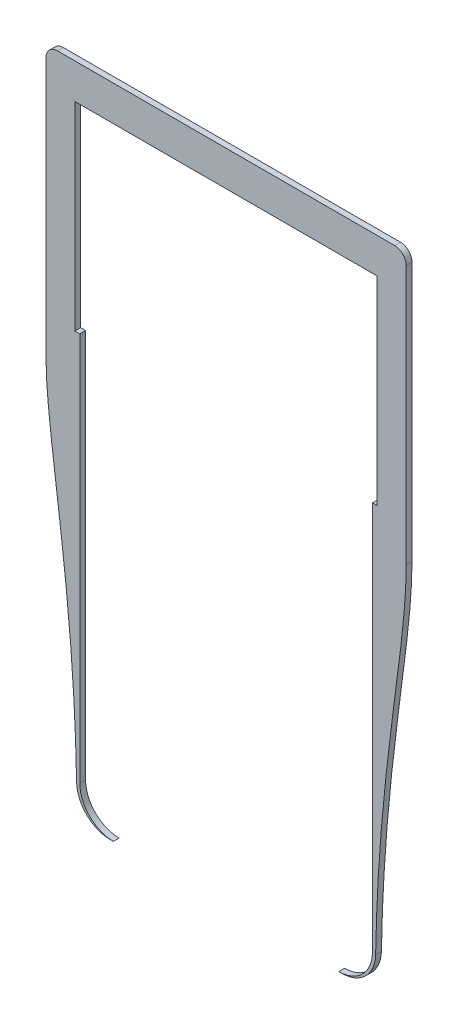
ISO-10303-21;
HEADER;
FILE_DESCRIPTION(('STEP AP214'),'2;1');
FILE_NAME('part.step','',(''),(''),'','','');
FILE_SCHEMA(('AUTOMOTIVE_DESIGN { 1 0 10303 214 1 1 1 1 }'));
ENDSEC;
DATA;
#1=APPLICATION_CONTEXT('core data for automotive mechanical design processes');
#2=APPLICATION_PROTOCOL_DEFINITION('international standard','automotive_design',2000,#1);
#3=PRODUCT_CONTEXT('',#1,'mechanical');
#4=PRODUCT('Part','Part','',(#3));
#5=PRODUCT_RELATED_PRODUCT_CATEGORY('part','',(#4));
#6=PRODUCT_DEFINITION_FORMATION('','',#4);
#7=PRODUCT_DEFINITION_CONTEXT('part definition',#1,'design');
#8=PRODUCT_DEFINITION('design','',#6,#7);
#9=PRODUCT_DEFINITION_SHAPE('','',#8);
#10=(LENGTH_UNIT() NAMED_UNIT(*) SI_UNIT(.MILLI.,.METRE.));
#11=(NAMED_UNIT(*) PLANE_ANGLE_UNIT() SI_UNIT($,.RADIAN.));
#12=(NAMED_UNIT(*) SI_UNIT($,.STERADIAN.) SOLID_ANGLE_UNIT());
#13=UNCERTAINTY_MEASURE_WITH_UNIT(LENGTH_MEASURE(1.E-05),#10,'distance_accuracy_value','');
#14=(GEOMETRIC_REPRESENTATION_CONTEXT(3) GLOBAL_UNCERTAINTY_ASSIGNED_CONTEXT((#13)) GLOBAL_UNIT_ASSIGNED_CONTEXT((#10,
#11,#12)) REPRESENTATION_CONTEXT('',''));
#15=CARTESIAN_POINT('',(0.,0.,0.));
#16=DIRECTION('',(0.,0.,1.));
#17=DIRECTION('',(1.,0.,0.));
#18=AXIS2_PLACEMENT_3D('',#15,#16,#17);
#19=CARTESIAN_POINT('',(109.710048323097,-66.929044414572,-1.5));
#20=DIRECTION('',(0.,-1.,0.));
#21=DIRECTION('',(0.,0.,-1.));
#22=AXIS2_PLACEMENT_3D('',#19,#20,#21);
#23=PLANE('',#22);
#24=DIRECTION('',(1.,0.,0.));
#25=VECTOR('',#24,1.);
#26=CARTESIAN_POINT('',(109.710048323097,-66.929044414572,0.));
#27=LINE('',#26,#25);
#28=CARTESIAN_POINT('',(118.330411381617,-66.929044414572,0.));
#29=VERTEX_POINT('',#28);
#30=CARTESIAN_POINT('',(119.160048323098,-66.929044414572,0.));
#31=VERTEX_POINT('',#30);
#32=EDGE_CURVE('E198',#29,#31,#27,.T.);
#33=ORIENTED_EDGE('',*,*,#32,.F.);
#34=DIRECTION('',(0.,0.,1.));
#35=VECTOR('',#34,1.);
#36=CARTESIAN_POINT('',(118.330411381617,-66.929044414572,-1.5));
#37=LINE('',#36,#35);
#38=CARTESIAN_POINT('',(118.330411381617,-66.929044414572,-1.5));
#39=VERTEX_POINT('',#38);
#40=EDGE_CURVE('E340',#29,#39,#37,.F.);
#41=ORIENTED_EDGE('',*,*,#40,.T.);
#42=DIRECTION('',(1.,0.,0.));
#43=VECTOR('',#42,1.);
#44=CARTESIAN_POINT('',(109.710048323097,-66.929044414572,-1.5));
#45=LINE('',#44,#43);
#46=CARTESIAN_POINT('',(119.160048323098,-66.929044414572,-1.5));
#47=VERTEX_POINT('',#46);
#48=EDGE_CURVE('E265',#39,#47,#45,.T.);
#49=ORIENTED_EDGE('',*,*,#48,.T.);
#50=DIRECTION('',(0.,0.,1.));
#51=VECTOR('',#50,1.);
#52=CARTESIAN_POINT('',(119.160048323098,-66.929044414572,-14.));
#53=LINE('',#52,#51);
#54=EDGE_CURVE('E183',#47,#31,#53,.T.);
#55=ORIENTED_EDGE('',*,*,#54,.T.);
#56=EDGE_LOOP('',(#33,#41,#49,#55));
#57=FACE_BOUND('',#56,.T.);
#58=ADVANCED_FACE('F33',(#57),#23,.T.);
#59=CARTESIAN_POINT('',(101.710048323097,33.070955585428,-1.5));
#60=CARTESIAN_POINT('',(101.710048323097,14.099715191449,-1.5));
#61=CARTESIAN_POINT('',(109.710048323097,-16.929044414572,-1.5));
#62=CARTESIAN_POINT('',(109.710048323097,-66.929044414572,-1.5));
#63=B_SPLINE_CURVE_WITH_KNOTS('',3,(#59,#60,#61,#62),.UNSPECIFIED.,.F.,.F.,(4,4),(0.,1.),.UNSPECIFIED.);
#64=DIRECTION('',(0.,0.,1.));
#65=VECTOR('',#64,1.);
#66=SURFACE_OF_LINEAR_EXTRUSION('',#63,#65);
#67=CARTESIAN_POINT('',(101.710048323097,33.070955585428,-1.5));
#68=VERTEX_POINT('',#67);
#69=CARTESIAN_POINT('',(109.63187503987,-58.3886235839805,-1.5));
#70=VERTEX_POINT('',#69);
#71=EDGE_CURVE('E257',#68,#70,#63,.T.);
#72=ORIENTED_EDGE('',*,*,#71,.T.);
#73=DIRECTION('',(0.,0.,1.));
#74=VECTOR('',#73,1.);
#75=CARTESIAN_POINT('',(109.63187503987,-58.3886235839805,-1.5));
#76=LINE('',#75,#74);
#77=CARTESIAN_POINT('',(109.63187503987,-58.3886235839805,0.));
#78=VERTEX_POINT('',#77);
#79=EDGE_CURVE('E337',#70,#78,#76,.T.);
#80=ORIENTED_EDGE('',*,*,#79,.T.);
#81=CARTESIAN_POINT('',(101.710048323097,33.070955585428,0.));
#82=CARTESIAN_POINT('',(101.710048323097,14.099715191449,0.));
#83=CARTESIAN_POINT('',(109.710048323097,-16.929044414572,0.));
#84=CARTESIAN_POINT('',(109.710048323097,-66.929044414572,0.));
#85=B_SPLINE_CURVE_WITH_KNOTS('',3,(#81,#82,#83,#84),.UNSPECIFIED.,.F.,.F.,(4,4),(0.,1.),.UNSPECIFIED.);
#86=CARTESIAN_POINT('',(101.710048323097,33.070955585428,0.));
#87=VERTEX_POINT('',#86);
#88=EDGE_CURVE('E256',#87,#78,#85,.T.);
#89=ORIENTED_EDGE('',*,*,#88,.F.);
#90=DIRECTION('',(0.,0.,1.));
#91=VECTOR('',#90,1.);
#92=CARTESIAN_POINT('',(101.710048323097,33.070955585428,-1.5));
#93=LINE('',#92,#91);
#94=EDGE_CURVE('E324',#68,#87,#93,.T.);
#95=ORIENTED_EDGE('',*,*,#94,.F.);
#96=EDGE_LOOP('',(#72,#80,#89,#95));
#97=FACE_BOUND('',#96,.T.);
#98=ADVANCED_FACE('F271',(#97),#66,.T.);
#99=CARTESIAN_POINT('',(101.710048323097,33.070955585428,-1.5));
#100=DIRECTION('',(1.,0.,0.));
#101=DIRECTION('',(0.,0.,-1.));
#102=AXIS2_PLACEMENT_3D('',#99,#100,#101);
#103=PLANE('',#102);
#104=DIRECTION('',(0.,1.,0.));
#105=VECTOR('',#104,1.);
#106=CARTESIAN_POINT('',(101.710048323097,33.070955585428,0.));
#107=LINE('',#106,#105);
#108=CARTESIAN_POINT('',(101.710048323097,100.170955585428,0.));
#109=VERTEX_POINT('',#108);
#110=EDGE_CURVE('E264',#87,#109,#107,.T.);
#111=ORIENTED_EDGE('',*,*,#110,.T.);
#112=DIRECTION('',(0.,0.,1.));
#113=VECTOR('',#112,1.);
#114=CARTESIAN_POINT('',(101.710048323097,100.170955585428,-1.5));
#115=LINE('',#114,#113);
#116=CARTESIAN_POINT('',(101.710048323097,100.170955585428,-1.5));
#117=VERTEX_POINT('',#116);
#118=EDGE_CURVE('E11',#109,#117,#115,.F.);
#119=ORIENTED_EDGE('',*,*,#118,.T.);
#120=DIRECTION('',(0.,1.,0.));
#121=VECTOR('',#120,1.);
#122=CARTESIAN_POINT('',(101.710048323097,33.070955585428,-1.5));
#123=LINE('',#122,#121);
#124=EDGE_CURVE('E389',#68,#117,#123,.T.);
#125=ORIENTED_EDGE('',*,*,#124,.F.);
#126=ORIENTED_EDGE('',*,*,#94,.T.);
#127=EDGE_LOOP('',(#111,#119,#125,#126));
#128=FACE_BOUND('',#127,.T.);
#129=ADVANCED_FACE('F275',(#128),#103,.F.);
#130=CARTESIAN_POINT('',(101.710048323097,103.170955585428,-1.5));
#131=DIRECTION('',(0.,-1.,0.));
#132=DIRECTION('',(0.,0.,-1.));
#133=AXIS2_PLACEMENT_3D('',#130,#131,#132);
#134=PLANE('',#133);
#135=DIRECTION('',(1.,0.,0.));
#136=VECTOR('',#135,1.);
#137=CARTESIAN_POINT('',(101.710048323097,103.170955585428,0.));
#138=LINE('',#137,#136);
#139=CARTESIAN_POINT('',(104.710048323097,103.170955585428,0.));
#140=VERTEX_POINT('',#139);
#141=CARTESIAN_POINT('',(192.010048323097,103.170955585428,0.));
#142=VERTEX_POINT('',#141);
#143=EDGE_CURVE('E366',#140,#142,#138,.T.);
#144=ORIENTED_EDGE('',*,*,#143,.T.);
#145=DIRECTION('',(0.,0.,1.));
#146=VECTOR('',#145,1.);
#147=CARTESIAN_POINT('',(192.010048323097,103.170955585428,-1.5));
#148=LINE('',#147,#146);
#149=CARTESIAN_POINT('',(192.010048323097,103.170955585428,-1.5));
#150=VERTEX_POINT('',#149);
#151=EDGE_CURVE('E54',#142,#150,#148,.F.);
#152=ORIENTED_EDGE('',*,*,#151,.T.);
#153=DIRECTION('',(1.,0.,0.));
#154=VECTOR('',#153,1.);
#155=CARTESIAN_POINT('',(101.710048323097,103.170955585428,-1.5));
#156=LINE('',#155,#154);
#157=CARTESIAN_POINT('',(104.710048323097,103.170955585428,-1.5));
#158=VERTEX_POINT('',#157);
#159=EDGE_CURVE('E358',#158,#150,#156,.T.);
#160=ORIENTED_EDGE('',*,*,#159,.F.);
#161=DIRECTION('',(0.,0.,1.));
#162=VECTOR('',#161,1.);
#163=CARTESIAN_POINT('',(104.710048323097,103.170955585428,-1.5));
#164=LINE('',#163,#162);
#165=EDGE_CURVE('E349',#158,#140,#164,.T.);
#166=ORIENTED_EDGE('',*,*,#165,.T.);
#167=EDGE_LOOP('',(#144,#152,#160,#166));
#168=FACE_BOUND('',#167,.T.);
#169=ADVANCED_FACE('F369',(#168),#134,.F.);
#170=CARTESIAN_POINT('',(195.010048323097,33.070955585428,-1.5));
#171=DIRECTION('',(1.,0.,0.));
#172=DIRECTION('',(0.,0.,-1.));
#173=AXIS2_PLACEMENT_3D('',#170,#171,#172);
#174=PLANE('',#173);
#175=DIRECTION('',(0.,1.,0.));
#176=VECTOR('',#175,1.);
#177=CARTESIAN_POINT('',(195.010048323097,33.070955585428,-1.5));
#178=LINE('',#177,#176);
#179=CARTESIAN_POINT('',(195.010048323097,33.070955585428,-1.5));
#180=VERTEX_POINT('',#179);
#181=CARTESIAN_POINT('',(195.010048323097,100.170955585428,-1.5));
#182=VERTEX_POINT('',#181);
#183=EDGE_CURVE('E357',#180,#182,#178,.T.);
#184=ORIENTED_EDGE('',*,*,#183,.T.);
#185=DIRECTION('',(0.,0.,1.));
#186=VECTOR('',#185,1.);
#187=CARTESIAN_POINT('',(195.010048323097,100.170955585428,0.));
#188=LINE('',#187,#186);
#189=CARTESIAN_POINT('',(195.010048323097,100.170955585428,0.));
#190=VERTEX_POINT('',#189);
#191=EDGE_CURVE('E342',#182,#190,#188,.T.);
#192=ORIENTED_EDGE('',*,*,#191,.T.);
#193=DIRECTION('',(0.,1.,0.));
#194=VECTOR('',#193,1.);
#195=CARTESIAN_POINT('',(195.010048323097,33.070955585428,0.));
#196=LINE('',#195,#194);
#197=CARTESIAN_POINT('',(195.010048323097,33.070955585428,0.));
#198=VERTEX_POINT('',#197);
#199=EDGE_CURVE('E368',#198,#190,#196,.T.);
#200=ORIENTED_EDGE('',*,*,#199,.F.);
#201=DIRECTION('',(0.,0.,1.));
#202=VECTOR('',#201,1.);
#203=CARTESIAN_POINT('',(195.010048323097,33.070955585428,-1.5));
#204=LINE('',#203,#202);
#205=EDGE_CURVE('E327',#180,#198,#204,.T.);
#206=ORIENTED_EDGE('',*,*,#205,.F.);
#207=EDGE_LOOP('',(#184,#192,#200,#206));
#208=FACE_BOUND('',#207,.T.);
#209=ADVANCED_FACE('F308',(#208),#174,.T.);
#210=CARTESIAN_POINT('',(195.010048323097,33.070955585428,-1.5));
#211=CARTESIAN_POINT('',(195.010048323097,11.3350971217336,-1.5));
#212=CARTESIAN_POINT('',(187.010048323097,-16.929044414572,-1.5));
#213=CARTESIAN_POINT('',(187.010048323097,-66.929044414572,-1.5));
#214=B_SPLINE_CURVE_WITH_KNOTS('',3,(#210,#211,#212,#213),.UNSPECIFIED.,.F.,.F.,(4,4),(0.,1.),.UNSPECIFIED.);
#215=DIRECTION('',(0.,0.,1.));
#216=VECTOR('',#215,1.);
#217=SURFACE_OF_LINEAR_EXTRUSION('',#214,#216);
#218=CARTESIAN_POINT('',(195.010048323097,33.070955585428,0.));
#219=CARTESIAN_POINT('',(195.010048323097,11.3350971217336,0.));
#220=CARTESIAN_POINT('',(187.010048323097,-16.929044414572,0.));
#221=CARTESIAN_POINT('',(187.010048323097,-66.929044414572,0.));
#222=B_SPLINE_CURVE_WITH_KNOTS('',3,(#218,#219,#220,#221),.UNSPECIFIED.,.F.,.F.,(4,4),(0.,1.),.UNSPECIFIED.);
#223=CARTESIAN_POINT('',(187.088683858466,-58.3900881925704,0.));
#224=VERTEX_POINT('',#223);
#225=EDGE_CURVE('E373',#198,#224,#222,.T.);
#226=ORIENTED_EDGE('',*,*,#225,.T.);
#227=DIRECTION('',(0.,0.,1.));
#228=VECTOR('',#227,1.);
#229=CARTESIAN_POINT('',(187.088683858466,-58.3900881925704,0.));
#230=LINE('',#229,#228);
#231=CARTESIAN_POINT('',(187.088683858466,-58.3900881925704,-1.5));
#232=VERTEX_POINT('',#231);
#233=EDGE_CURVE('E332',#224,#232,#230,.F.);
#234=ORIENTED_EDGE('',*,*,#233,.T.);
#235=EDGE_CURVE('E363',#180,#232,#214,.T.);
#236=ORIENTED_EDGE('',*,*,#235,.F.);
#237=ORIENTED_EDGE('',*,*,#205,.T.);
#238=EDGE_LOOP('',(#226,#234,#236,#237));
#239=FACE_BOUND('',#238,.T.);
#240=ADVANCED_FACE('F300',(#239),#217,.F.);
#241=CARTESIAN_POINT('',(177.560048323097,-66.929044414572,-1.5));
#242=VERTEX_POINT('',#241);
#243=CARTESIAN_POINT('',(178.390174509068,-66.929044414572,-1.5));
#244=VERTEX_POINT('',#243);
#245=EDGE_CURVE('E263',#242,#244,#45,.T.);
#246=ORIENTED_EDGE('',*,*,#245,.T.);
#247=DIRECTION('',(0.,0.,-1.));
#248=VECTOR('',#247,1.);
#249=CARTESIAN_POINT('',(178.390174509068,-66.929044414572,0.));
#250=LINE('',#249,#248);
#251=CARTESIAN_POINT('',(178.390174509068,-66.929044414572,0.));
#252=VERTEX_POINT('',#251);
#253=EDGE_CURVE('E316',#244,#252,#250,.F.);
#254=ORIENTED_EDGE('',*,*,#253,.T.);
#255=CARTESIAN_POINT('',(177.560048323097,-66.929044414572,0.));
#256=VERTEX_POINT('',#255);
#257=EDGE_CURVE('E384',#256,#252,#27,.T.);
#258=ORIENTED_EDGE('',*,*,#257,.F.);
#259=DIRECTION('',(0.,0.,1.));
#260=VECTOR('',#259,1.);
#261=CARTESIAN_POINT('',(177.560048323097,-66.929044414572,-14.));
#262=LINE('',#261,#260);
#263=EDGE_CURVE('E233',#242,#256,#262,.T.);
#264=ORIENTED_EDGE('',*,*,#263,.F.);
#265=EDGE_LOOP('',(#246,#254,#258,#264));
#266=FACE_BOUND('',#265,.T.);
#267=ADVANCED_FACE('F277',(#266),#23,.T.);
#268=CARTESIAN_POINT('',(105.710048323097,-5.29325956231415,-1.5));
#269=DIRECTION('',(0.,0.,-1.));
#270=DIRECTION('',(-1.,0.,0.));
#271=AXIS2_PLACEMENT_3D('',#268,#269,#270);
#272=PLANE('',#271);
#273=ORIENTED_EDGE('',*,*,#159,.T.);
#274=CARTESIAN_POINT('',(192.010048323097,100.170955585428,-1.5));
#275=DIRECTION('',(0.,0.,-1.));
#276=DIRECTION('',(-1.,0.,0.));
#277=AXIS2_PLACEMENT_3D('',#274,#275,#276);
#278=CIRCLE('',#277,3.);
#279=EDGE_CURVE('E41',#150,#182,#278,.T.);
#280=ORIENTED_EDGE('',*,*,#279,.T.);
#281=ORIENTED_EDGE('',*,*,#183,.F.);
#282=ORIENTED_EDGE('',*,*,#235,.T.);
#283=CARTESIAN_POINT('',(178.390174509068,-58.2290444145721,-1.5));
#284=DIRECTION('',(0.,0.,-1.));
#285=DIRECTION('',(-1.,0.,0.));
#286=AXIS2_PLACEMENT_3D('',#283,#284,#285);
#287=CIRCLE('',#286,8.7);
#288=EDGE_CURVE('E321',#232,#244,#287,.T.);
#289=ORIENTED_EDGE('',*,*,#288,.T.);
#290=ORIENTED_EDGE('',*,*,#245,.F.);
#291=CARTESIAN_POINT('',(177.560048323097,-58.229044414572,-1.5));
#292=DIRECTION('',(0.,0.,-1.));
#293=DIRECTION('',(-1.,0.,0.));
#294=AXIS2_PLACEMENT_3D('',#291,#292,#293);
#295=CIRCLE('',#294,8.69999999999999);
#296=CARTESIAN_POINT('',(186.260048323097,-58.229044414572,-1.5));
#297=VERTEX_POINT('',#296);
#298=EDGE_CURVE('E239',#297,#242,#295,.T.);
#299=ORIENTED_EDGE('',*,*,#298,.F.);
#300=DIRECTION('',(0.,1.,0.));
#301=VECTOR('',#300,1.);
#302=CARTESIAN_POINT('',(186.260048323097,-5.29325956231413,-1.5));
#303=LINE('',#302,#301);
#304=CARTESIAN_POINT('',(186.260048323097,42.570955585428,-1.5));
#305=VERTEX_POINT('',#304);
#306=EDGE_CURVE('E241',#297,#305,#303,.T.);
#307=ORIENTED_EDGE('',*,*,#306,.T.);
#308=DIRECTION('',(-1.,0.,0.));
#309=VECTOR('',#308,1.);
#310=CARTESIAN_POINT('',(105.710048323097,42.570955585428,-1.5));
#311=LINE('',#310,#309);
#312=CARTESIAN_POINT('',(187.460048323097,42.570955585428,-1.5));
#313=VERTEX_POINT('',#312);
#314=EDGE_CURVE('E244',#313,#305,#311,.T.);
#315=ORIENTED_EDGE('',*,*,#314,.F.);
#316=DIRECTION('',(0.,1.,0.));
#317=VECTOR('',#316,1.);
#318=CARTESIAN_POINT('',(187.460048323097,-5.29325956231415,-1.5));
#319=LINE('',#318,#317);
#320=CARTESIAN_POINT('',(187.460048323097,94.070955585428,-1.5));
#321=VERTEX_POINT('',#320);
#322=EDGE_CURVE('E246',#313,#321,#319,.T.);
#323=ORIENTED_EDGE('',*,*,#322,.T.);
#324=DIRECTION('',(-1.,0.,0.));
#325=VECTOR('',#324,1.);
#326=CARTESIAN_POINT('',(105.710048323097,94.070955585428,-1.5));
#327=LINE('',#326,#325);
#328=CARTESIAN_POINT('',(109.160048323097,94.070955585428,-1.5));
#329=VERTEX_POINT('',#328);
#330=EDGE_CURVE('E249',#321,#329,#327,.T.);
#331=ORIENTED_EDGE('',*,*,#330,.T.);
#332=DIRECTION('',(0.,1.,0.));
#333=VECTOR('',#332,1.);
#334=CARTESIAN_POINT('',(109.160048323097,-5.29325956231415,-1.5));
#335=LINE('',#334,#333);
#336=CARTESIAN_POINT('',(109.160048323097,42.570955585428,-1.5));
#337=VERTEX_POINT('',#336);
#338=EDGE_CURVE('E252',#337,#329,#335,.T.);
#339=ORIENTED_EDGE('',*,*,#338,.F.);
#340=DIRECTION('',(-1.,0.,0.));
#341=VECTOR('',#340,1.);
#342=CARTESIAN_POINT('',(105.710048323097,42.570955585428,-1.5));
#343=LINE('',#342,#341);
#344=CARTESIAN_POINT('',(110.460048323097,42.570955585428,-1.5));
#345=VERTEX_POINT('',#344);
#346=EDGE_CURVE('E254',#345,#337,#343,.T.);
#347=ORIENTED_EDGE('',*,*,#346,.F.);
#348=DIRECTION('',(0.,1.,0.));
#349=VECTOR('',#348,1.);
#350=CARTESIAN_POINT('',(110.460048323097,-5.29325956231415,-1.5));
#351=LINE('',#350,#349);
#352=CARTESIAN_POINT('',(110.460048323097,-58.229044414572,-1.5));
#353=VERTEX_POINT('',#352);
#354=EDGE_CURVE('E222',#353,#345,#351,.T.);
#355=ORIENTED_EDGE('',*,*,#354,.F.);
#356=CARTESIAN_POINT('',(119.160048323097,-58.229044414572,-1.5));
#357=DIRECTION('',(0.,0.,-1.));
#358=DIRECTION('',(-1.,0.,0.));
#359=AXIS2_PLACEMENT_3D('',#356,#357,#358);
#360=CIRCLE('',#359,8.7);
#361=EDGE_CURVE('E180',#47,#353,#360,.T.);
#362=ORIENTED_EDGE('',*,*,#361,.F.);
#363=ORIENTED_EDGE('',*,*,#48,.F.);
#364=CARTESIAN_POINT('',(118.330411381617,-58.229044414572,-1.5));
#365=DIRECTION('',(0.,0.,-1.));
#366=DIRECTION('',(-1.,0.,0.));
#367=AXIS2_PLACEMENT_3D('',#364,#365,#366);
#368=CIRCLE('',#367,8.7);
#369=EDGE_CURVE('E334',#39,#70,#368,.T.);
#370=ORIENTED_EDGE('',*,*,#369,.T.);
#371=ORIENTED_EDGE('',*,*,#71,.F.);
#372=ORIENTED_EDGE('',*,*,#124,.T.);
#373=CARTESIAN_POINT('',(104.710048323097,100.170955585428,-1.5));
#374=DIRECTION('',(0.,0.,-1.));
#375=DIRECTION('',(-1.,0.,0.));
#376=AXIS2_PLACEMENT_3D('',#373,#374,#375);
#377=CIRCLE('',#376,3.);
#378=EDGE_CURVE('E353',#117,#158,#377,.T.);
#379=ORIENTED_EDGE('',*,*,#378,.T.);
#380=EDGE_LOOP('',(#273,#280,#281,#282,#289,#290,#299,#307,#315,#323,#331,#339,#347,#355,#362,
#363,#370,#371,#372,#379));
#381=FACE_BOUND('',#380,.T.);
#382=ADVANCED_FACE('F299',(#381),#272,.T.);
#383=CARTESIAN_POINT('',(105.710048323097,-5.29325956231415,0.));
#384=DIRECTION('',(0.,0.,-1.));
#385=DIRECTION('',(-1.,0.,0.));
#386=AXIS2_PLACEMENT_3D('',#383,#384,#385);
#387=PLANE('',#386);
#388=ORIENTED_EDGE('',*,*,#199,.T.);
#389=CARTESIAN_POINT('',(192.010048323097,100.170955585428,0.));
#390=DIRECTION('',(0.,0.,-1.));
#391=DIRECTION('',(-1.,0.,0.));
#392=AXIS2_PLACEMENT_3D('',#389,#390,#391);
#393=CIRCLE('',#392,3.);
#394=EDGE_CURVE('E347',#190,#142,#393,.F.);
#395=ORIENTED_EDGE('',*,*,#394,.T.);
#396=ORIENTED_EDGE('',*,*,#143,.F.);
#397=CARTESIAN_POINT('',(104.710048323097,100.170955585428,0.));
#398=DIRECTION('',(0.,0.,-1.));
#399=DIRECTION('',(-1.,0.,0.));
#400=AXIS2_PLACEMENT_3D('',#397,#398,#399);
#401=CIRCLE('',#400,3.);
#402=EDGE_CURVE('E345',#140,#109,#401,.F.);
#403=ORIENTED_EDGE('',*,*,#402,.T.);
#404=ORIENTED_EDGE('',*,*,#110,.F.);
#405=ORIENTED_EDGE('',*,*,#88,.T.);
#406=CARTESIAN_POINT('',(118.330411381617,-58.229044414572,0.));
#407=DIRECTION('',(0.,0.,-1.));
#408=DIRECTION('',(-1.,0.,0.));
#409=AXIS2_PLACEMENT_3D('',#406,#407,#408);
#410=CIRCLE('',#409,8.7);
#411=EDGE_CURVE('E323',#78,#29,#410,.F.);
#412=ORIENTED_EDGE('',*,*,#411,.T.);
#413=ORIENTED_EDGE('',*,*,#32,.T.);
#414=CARTESIAN_POINT('',(119.160048323097,-58.229044414572,0.));
#415=DIRECTION('',(0.,0.,1.));
#416=DIRECTION('',(1.,0.,0.));
#417=AXIS2_PLACEMENT_3D('',#414,#415,#416);
#418=CIRCLE('',#417,8.7);
#419=CARTESIAN_POINT('',(110.460048323097,-58.229044414572,0.));
#420=VERTEX_POINT('',#419);
#421=EDGE_CURVE('E177',#420,#31,#418,.T.);
#422=ORIENTED_EDGE('',*,*,#421,.F.);
#423=DIRECTION('',(0.,-1.,0.));
#424=VECTOR('',#423,1.);
#425=CARTESIAN_POINT('',(110.460048323097,42.570955585428,0.));
#426=LINE('',#425,#424);
#427=CARTESIAN_POINT('',(110.460048323097,42.570955585428,0.));
#428=VERTEX_POINT('',#427);
#429=EDGE_CURVE('E188',#428,#420,#426,.T.);
#430=ORIENTED_EDGE('',*,*,#429,.F.);
#431=DIRECTION('',(1.,0.,0.));
#432=VECTOR('',#431,1.);
#433=CARTESIAN_POINT('',(109.160048323097,42.570955585428,0.));
#434=LINE('',#433,#432);
#435=CARTESIAN_POINT('',(109.160048323097,42.570955585428,0.));
#436=VERTEX_POINT('',#435);
#437=EDGE_CURVE('E193',#436,#428,#434,.T.);
#438=ORIENTED_EDGE('',*,*,#437,.F.);
#439=DIRECTION('',(0.,-1.,0.));
#440=VECTOR('',#439,1.);
#441=CARTESIAN_POINT('',(109.160048323097,94.070955585428,0.));
#442=LINE('',#441,#440);
#443=CARTESIAN_POINT('',(109.160048323097,94.070955585428,0.));
#444=VERTEX_POINT('',#443);
#445=EDGE_CURVE('E217',#444,#436,#442,.T.);
#446=ORIENTED_EDGE('',*,*,#445,.F.);
#447=DIRECTION('',(1.,0.,0.));
#448=VECTOR('',#447,1.);
#449=CARTESIAN_POINT('',(109.160048323097,94.070955585428,0.));
#450=LINE('',#449,#448);
#451=CARTESIAN_POINT('',(187.460048323097,94.070955585428,0.));
#452=VERTEX_POINT('',#451);
#453=EDGE_CURVE('E214',#444,#452,#450,.T.);
#454=ORIENTED_EDGE('',*,*,#453,.T.);
#455=DIRECTION('',(0.,-1.,0.));
#456=VECTOR('',#455,1.);
#457=CARTESIAN_POINT('',(187.460048323097,94.070955585428,0.));
#458=LINE('',#457,#456);
#459=CARTESIAN_POINT('',(187.460048323097,42.570955585428,0.));
#460=VERTEX_POINT('',#459);
#461=EDGE_CURVE('E211',#452,#460,#458,.T.);
#462=ORIENTED_EDGE('',*,*,#461,.T.);
#463=DIRECTION('',(1.,0.,0.));
#464=VECTOR('',#463,1.);
#465=CARTESIAN_POINT('',(186.260048323097,42.570955585428,0.));
#466=LINE('',#465,#464);
#467=CARTESIAN_POINT('',(186.260048323097,42.570955585428,0.));
#468=VERTEX_POINT('',#467);
#469=EDGE_CURVE('E208',#468,#460,#466,.T.);
#470=ORIENTED_EDGE('',*,*,#469,.F.);
#471=DIRECTION('',(0.,-1.,0.));
#472=VECTOR('',#471,1.);
#473=CARTESIAN_POINT('',(186.260048323097,42.570955585428,0.));
#474=LINE('',#473,#472);
#475=CARTESIAN_POINT('',(186.260048323097,-58.229044414572,0.));
#476=VERTEX_POINT('',#475);
#477=EDGE_CURVE('E202',#468,#476,#474,.T.);
#478=ORIENTED_EDGE('',*,*,#477,.T.);
#479=CARTESIAN_POINT('',(177.560048323097,-58.229044414572,0.));
#480=DIRECTION('',(0.,0.,1.));
#481=DIRECTION('',(1.,0.,0.));
#482=AXIS2_PLACEMENT_3D('',#479,#480,#481);
#483=CIRCLE('',#482,8.69999999999999);
#484=EDGE_CURVE('E199',#256,#476,#483,.T.);
#485=ORIENTED_EDGE('',*,*,#484,.F.);
#486=ORIENTED_EDGE('',*,*,#257,.T.);
#487=CARTESIAN_POINT('',(178.390174509068,-58.2290444145721,0.));
#488=DIRECTION('',(0.,0.,-1.));
#489=DIRECTION('',(-1.,0.,0.));
#490=AXIS2_PLACEMENT_3D('',#487,#488,#489);
#491=CIRCLE('',#490,8.7);
#492=EDGE_CURVE('E322',#252,#224,#491,.F.);
#493=ORIENTED_EDGE('',*,*,#492,.T.);
#494=ORIENTED_EDGE('',*,*,#225,.F.);
#495=EDGE_LOOP('',(#388,#395,#396,#403,#404,#405,#412,#413,#422,#430,#438,#446,#454,#462,#470,
#478,#485,#486,#493,#494));
#496=FACE_BOUND('',#495,.T.);
#497=ADVANCED_FACE('F196',(#496),#387,.F.);
#498=CARTESIAN_POINT('',(109.160048323097,42.570955585428,-14.));
#499=DIRECTION('',(0.,-1.,0.));
#500=DIRECTION('',(0.,0.,-1.));
#501=AXIS2_PLACEMENT_3D('',#498,#499,#500);
#502=PLANE('',#501);
#503=ORIENTED_EDGE('',*,*,#346,.T.);
#504=DIRECTION('',(0.,0.,1.));
#505=VECTOR('',#504,1.);
#506=CARTESIAN_POINT('',(109.160048323097,42.570955585428,-14.));
#507=LINE('',#506,#505);
#508=EDGE_CURVE('E220',#337,#436,#507,.T.);
#509=ORIENTED_EDGE('',*,*,#508,.T.);
#510=ORIENTED_EDGE('',*,*,#437,.T.);
#511=DIRECTION('',(0.,0.,1.));
#512=VECTOR('',#511,1.);
#513=CARTESIAN_POINT('',(110.460048323097,42.570955585428,-14.));
#514=LINE('',#513,#512);
#515=EDGE_CURVE('E184',#345,#428,#514,.T.);
#516=ORIENTED_EDGE('',*,*,#515,.F.);
#517=EDGE_LOOP('',(#503,#509,#510,#516));
#518=FACE_BOUND('',#517,.T.);
#519=ADVANCED_FACE('F408',(#518),#502,.F.);
#520=CARTESIAN_POINT('',(109.160048323097,94.070955585428,-14.));
#521=DIRECTION('',(-1.,0.,0.));
#522=DIRECTION('',(0.,0.,1.));
#523=AXIS2_PLACEMENT_3D('',#520,#521,#522);
#524=PLANE('',#523);
#525=ORIENTED_EDGE('',*,*,#338,.T.);
#526=DIRECTION('',(0.,0.,1.));
#527=VECTOR('',#526,1.);
#528=CARTESIAN_POINT('',(109.160048323097,94.070955585428,-14.));
#529=LINE('',#528,#527);
#530=EDGE_CURVE('E223',#329,#444,#529,.T.);
#531=ORIENTED_EDGE('',*,*,#530,.T.);
#532=ORIENTED_EDGE('',*,*,#445,.T.);
#533=ORIENTED_EDGE('',*,*,#508,.F.);
#534=EDGE_LOOP('',(#525,#531,#532,#533));
#535=FACE_BOUND('',#534,.T.);
#536=ADVANCED_FACE('F412',(#535),#524,.F.);
#537=CARTESIAN_POINT('',(109.160048323097,94.070955585428,-14.));
#538=DIRECTION('',(0.,-1.,0.));
#539=DIRECTION('',(0.,0.,-1.));
#540=AXIS2_PLACEMENT_3D('',#537,#538,#539);
#541=PLANE('',#540);
#542=DIRECTION('',(0.,0.,1.));
#543=VECTOR('',#542,1.);
#544=CARTESIAN_POINT('',(187.460048323097,94.070955585428,-14.));
#545=LINE('',#544,#543);
#546=EDGE_CURVE('E225',#321,#452,#545,.T.);
#547=ORIENTED_EDGE('',*,*,#546,.T.);
#548=ORIENTED_EDGE('',*,*,#453,.F.);
#549=ORIENTED_EDGE('',*,*,#530,.F.);
#550=ORIENTED_EDGE('',*,*,#330,.F.);
#551=EDGE_LOOP('',(#547,#548,#549,#550));
#552=FACE_BOUND('',#551,.T.);
#553=ADVANCED_FACE('F433',(#552),#541,.T.);
#554=CARTESIAN_POINT('',(187.460048323097,94.070955585428,-14.));
#555=DIRECTION('',(-1.,0.,0.));
#556=DIRECTION('',(0.,0.,1.));
#557=AXIS2_PLACEMENT_3D('',#554,#555,#556);
#558=PLANE('',#557);
#559=DIRECTION('',(0.,0.,1.));
#560=VECTOR('',#559,1.);
#561=CARTESIAN_POINT('',(187.460048323097,42.570955585428,-14.));
#562=LINE('',#561,#560);
#563=EDGE_CURVE('E227',#313,#460,#562,.T.);
#564=ORIENTED_EDGE('',*,*,#563,.T.);
#565=ORIENTED_EDGE('',*,*,#461,.F.);
#566=ORIENTED_EDGE('',*,*,#546,.F.);
#567=ORIENTED_EDGE('',*,*,#322,.F.);
#568=EDGE_LOOP('',(#564,#565,#566,#567));
#569=FACE_BOUND('',#568,.T.);
#570=ADVANCED_FACE('F429',(#569),#558,.T.);
#571=CARTESIAN_POINT('',(186.260048323097,42.570955585428,-14.));
#572=DIRECTION('',(0.,-1.,0.));
#573=DIRECTION('',(0.,0.,-1.));
#574=AXIS2_PLACEMENT_3D('',#571,#572,#573);
#575=PLANE('',#574);
#576=ORIENTED_EDGE('',*,*,#314,.T.);
#577=DIRECTION('',(0.,0.,1.));
#578=VECTOR('',#577,1.);
#579=CARTESIAN_POINT('',(186.260048323097,42.570955585428,-14.));
#580=LINE('',#579,#578);
#581=EDGE_CURVE('E229',#305,#468,#580,.T.);
#582=ORIENTED_EDGE('',*,*,#581,.T.);
#583=ORIENTED_EDGE('',*,*,#469,.T.);
#584=ORIENTED_EDGE('',*,*,#563,.F.);
#585=EDGE_LOOP('',(#576,#582,#583,#584));
#586=FACE_BOUND('',#585,.T.);
#587=ADVANCED_FACE('F425',(#586),#575,.F.);
#588=CARTESIAN_POINT('',(186.260048323097,42.570955585428,-14.));
#589=DIRECTION('',(-1.,0.,0.));
#590=DIRECTION('',(0.,-1.,0.));
#591=AXIS2_PLACEMENT_3D('',#588,#589,#590);
#592=PLANE('',#591);
#593=DIRECTION('',(0.,0.,1.));
#594=VECTOR('',#593,1.);
#595=CARTESIAN_POINT('',(186.260048323097,-58.229044414572,-14.));
#596=LINE('',#595,#594);
#597=EDGE_CURVE('E231',#297,#476,#596,.T.);
#598=ORIENTED_EDGE('',*,*,#597,.T.);
#599=ORIENTED_EDGE('',*,*,#477,.F.);
#600=ORIENTED_EDGE('',*,*,#581,.F.);
#601=ORIENTED_EDGE('',*,*,#306,.F.);
#602=EDGE_LOOP('',(#598,#599,#600,#601));
#603=FACE_BOUND('',#602,.T.);
#604=ADVANCED_FACE('F421',(#603),#592,.T.);
#605=CARTESIAN_POINT('',(177.560048323097,-58.229044414572,-14.));
#606=DIRECTION('',(0.,0.,1.));
#607=DIRECTION('',(1.,0.,0.));
#608=AXIS2_PLACEMENT_3D('',#605,#606,#607);
#609=CYLINDRICAL_SURFACE('',#608,8.69999999999999);
#610=ORIENTED_EDGE('',*,*,#298,.T.);
#611=ORIENTED_EDGE('',*,*,#263,.T.);
#612=ORIENTED_EDGE('',*,*,#484,.T.);
#613=ORIENTED_EDGE('',*,*,#597,.F.);
#614=EDGE_LOOP('',(#610,#611,#612,#613));
#615=FACE_BOUND('',#614,.T.);
#616=ADVANCED_FACE('F418',(#615),#609,.F.);
#617=CARTESIAN_POINT('',(119.160048323097,-58.229044414572,-14.));
#618=DIRECTION('',(0.,0.,1.));
#619=DIRECTION('',(1.,0.,0.));
#620=AXIS2_PLACEMENT_3D('',#617,#618,#619);
#621=CYLINDRICAL_SURFACE('',#620,8.7);
#622=ORIENTED_EDGE('',*,*,#361,.T.);
#623=DIRECTION('',(0.,0.,1.));
#624=VECTOR('',#623,1.);
#625=CARTESIAN_POINT('',(110.460048323097,-58.229044414572,-14.));
#626=LINE('',#625,#624);
#627=EDGE_CURVE('E172',#353,#420,#626,.T.);
#628=ORIENTED_EDGE('',*,*,#627,.T.);
#629=ORIENTED_EDGE('',*,*,#421,.T.);
#630=ORIENTED_EDGE('',*,*,#54,.F.);
#631=EDGE_LOOP('',(#622,#628,#629,#630));
#632=FACE_BOUND('',#631,.T.);
#633=ADVANCED_FACE('F174',(#632),#621,.F.);
#634=CARTESIAN_POINT('',(110.460048323097,42.570955585428,-14.));
#635=DIRECTION('',(-1.,0.,0.));
#636=DIRECTION('',(0.,-1.,0.));
#637=AXIS2_PLACEMENT_3D('',#634,#635,#636);
#638=PLANE('',#637);
#639=ORIENTED_EDGE('',*,*,#354,.T.);
#640=ORIENTED_EDGE('',*,*,#515,.T.);
#641=ORIENTED_EDGE('',*,*,#429,.T.);
#642=ORIENTED_EDGE('',*,*,#627,.F.);
#643=EDGE_LOOP('',(#639,#640,#641,#642));
#644=FACE_BOUND('',#643,.T.);
#645=ADVANCED_FACE('F189',(#644),#638,.F.);
#646=CARTESIAN_POINT('',(178.390174509068,-58.2290444145721,-0.75));
#647=DIRECTION('',(0.,0.,1.));
#648=DIRECTION('',(1.,0.,0.));
#649=AXIS2_PLACEMENT_3D('',#646,#647,#648);
#650=CYLINDRICAL_SURFACE('',#649,8.7);
#651=ORIENTED_EDGE('',*,*,#288,.F.);
#652=ORIENTED_EDGE('',*,*,#233,.F.);
#653=ORIENTED_EDGE('',*,*,#492,.F.);
#654=ORIENTED_EDGE('',*,*,#253,.F.);
#655=EDGE_LOOP('',(#651,#652,#653,#654));
#656=FACE_BOUND('',#655,.T.);
#657=ADVANCED_FACE('F279',(#656),#650,.T.);
#658=CARTESIAN_POINT('',(118.330411381617,-58.229044414572,-0.75));
#659=DIRECTION('',(0.,0.,1.));
#660=DIRECTION('',(1.,0.,0.));
#661=AXIS2_PLACEMENT_3D('',#658,#659,#660);
#662=CYLINDRICAL_SURFACE('',#661,8.7);
#663=ORIENTED_EDGE('',*,*,#369,.F.);
#664=ORIENTED_EDGE('',*,*,#40,.F.);
#665=ORIENTED_EDGE('',*,*,#411,.F.);
#666=ORIENTED_EDGE('',*,*,#79,.F.);
#667=EDGE_LOOP('',(#663,#664,#665,#666));
#668=FACE_BOUND('',#667,.T.);
#669=ADVANCED_FACE('F282',(#668),#662,.T.);
#670=CARTESIAN_POINT('',(192.010048323097,100.170955585428,-1.5));
#671=DIRECTION('',(0.,0.,-1.));
#672=DIRECTION('',(-1.,0.,0.));
#673=AXIS2_PLACEMENT_3D('',#670,#671,#672);
#674=CYLINDRICAL_SURFACE('',#673,3.);
#675=ORIENTED_EDGE('',*,*,#279,.F.);
#676=ORIENTED_EDGE('',*,*,#151,.F.);
#677=ORIENTED_EDGE('',*,*,#394,.F.);
#678=ORIENTED_EDGE('',*,*,#191,.F.);
#679=EDGE_LOOP('',(#675,#676,#677,#678));
#680=FACE_BOUND('',#679,.T.);
#681=ADVANCED_FACE('F285',(#680),#674,.T.);
#682=CARTESIAN_POINT('',(104.710048323097,100.170955585428,-1.5));
#683=DIRECTION('',(0.,0.,1.));
#684=DIRECTION('',(1.,0.,0.));
#685=AXIS2_PLACEMENT_3D('',#682,#683,#684);
#686=CYLINDRICAL_SURFACE('',#685,3.);
#687=ORIENTED_EDGE('',*,*,#378,.F.);
#688=ORIENTED_EDGE('',*,*,#118,.F.);
#689=ORIENTED_EDGE('',*,*,#402,.F.);
#690=ORIENTED_EDGE('',*,*,#165,.F.);
#691=EDGE_LOOP('',(#687,#688,#689,#690));
#692=FACE_BOUND('',#691,.T.);
#693=ADVANCED_FACE('F35',(#692),#686,.T.);
#694=CLOSED_SHELL('',(#58,#98,#129,#169,#209,#240,#267,#382,#497,#519,#536,#553,#570,#587,#604,
#616,#633,#645,#657,#669,#681,#693));
#695=MANIFOLD_SOLID_BREP('B2',#694);
#696=ADVANCED_BREP_SHAPE_REPRESENTATION('',(#18,#695),#14);
#697=SHAPE_DEFINITION_REPRESENTATION(#9,#696);
ENDSEC;
END-ISO-10303-21;
